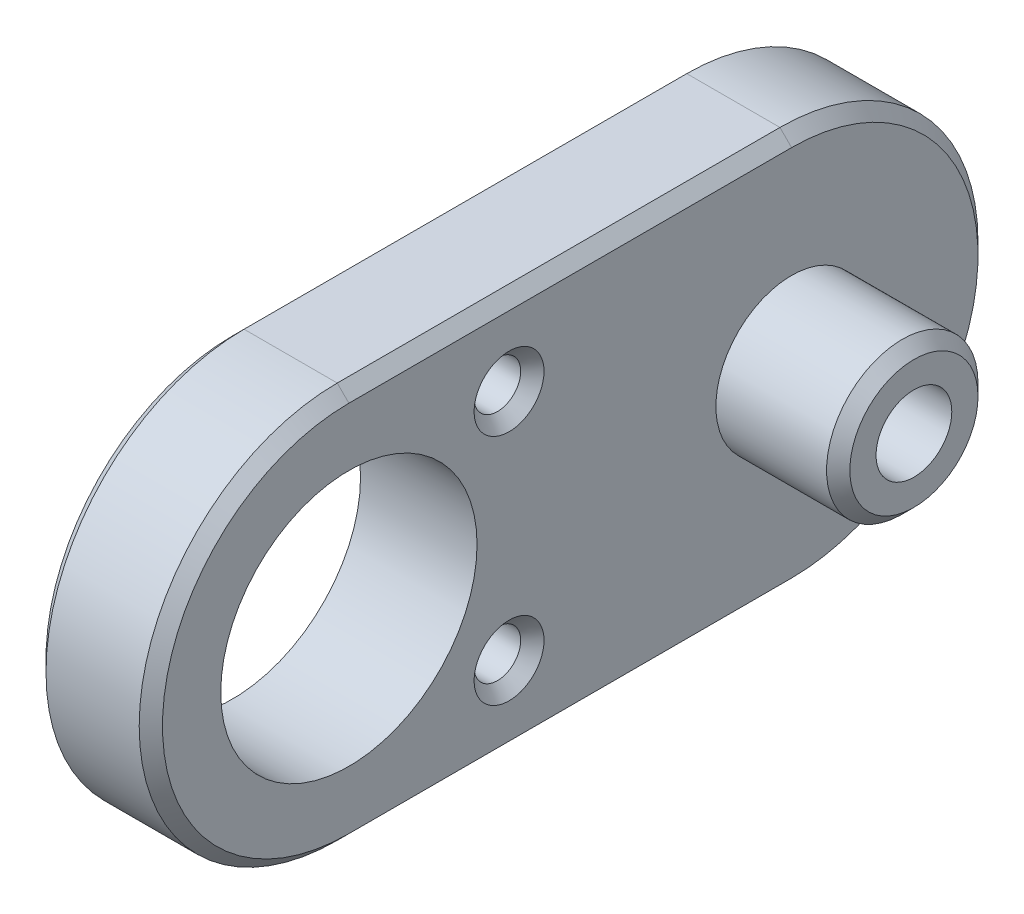
ISO-10303-21;
HEADER;
FILE_DESCRIPTION(('STEP AP214'),'2;1');
FILE_NAME('part.step','',(''),(''),'','','');
FILE_SCHEMA(('AUTOMOTIVE_DESIGN { 1 0 10303 214 1 1 1 1 }'));
ENDSEC;
DATA;
#1=APPLICATION_CONTEXT('core data for automotive mechanical design processes');
#2=APPLICATION_PROTOCOL_DEFINITION('international standard','automotive_design',2000,#1);
#3=PRODUCT_CONTEXT('',#1,'mechanical');
#4=PRODUCT('Part','Part','',(#3));
#5=PRODUCT_RELATED_PRODUCT_CATEGORY('part','',(#4));
#6=PRODUCT_DEFINITION_FORMATION('','',#4);
#7=PRODUCT_DEFINITION_CONTEXT('part definition',#1,'design');
#8=PRODUCT_DEFINITION('design','',#6,#7);
#9=PRODUCT_DEFINITION_SHAPE('','',#8);
#10=(LENGTH_UNIT() NAMED_UNIT(*) SI_UNIT(.MILLI.,.METRE.));
#11=(NAMED_UNIT(*) PLANE_ANGLE_UNIT() SI_UNIT($,.RADIAN.));
#12=(NAMED_UNIT(*) SI_UNIT($,.STERADIAN.) SOLID_ANGLE_UNIT());
#13=UNCERTAINTY_MEASURE_WITH_UNIT(LENGTH_MEASURE(1.E-05),#10,'distance_accuracy_value','');
#14=(GEOMETRIC_REPRESENTATION_CONTEXT(3) GLOBAL_UNCERTAINTY_ASSIGNED_CONTEXT((#13)) GLOBAL_UNIT_ASSIGNED_CONTEXT((#10,
#11,#12)) REPRESENTATION_CONTEXT('',''));
#15=CARTESIAN_POINT('',(0.,0.,0.));
#16=DIRECTION('',(0.,0.,1.));
#17=DIRECTION('',(1.,0.,0.));
#18=AXIS2_PLACEMENT_3D('',#15,#16,#17);
#19=CARTESIAN_POINT('',(5.,0.,0.));
#20=DIRECTION('',(-1.,0.,0.));
#21=DIRECTION('',(0.,0.,1.));
#22=AXIS2_PLACEMENT_3D('',#19,#20,#21);
#23=CYLINDRICAL_SURFACE('',#22,1.625);
#24=CARTESIAN_POINT('',(10.25,0.,0.));
#25=DIRECTION('',(1.,0.,0.));
#26=DIRECTION('',(0.,0.,-1.));
#27=AXIS2_PLACEMENT_3D('',#24,#25,#26);
#28=CIRCLE('',#27,1.625);
#29=CARTESIAN_POINT('',(10.25,0.,-1.625));
#30=VERTEX_POINT('',#29);
#31=EDGE_CURVE('E240',#30,#30,#28,.T.);
#32=ORIENTED_EDGE('',*,*,#31,.T.);
#33=EDGE_LOOP('',(#32));
#34=FACE_BOUND('',#33,.T.);
#35=CARTESIAN_POINT('',(3.,0.,0.));
#36=DIRECTION('',(-1.,0.,0.));
#37=DIRECTION('',(0.,0.,1.));
#38=AXIS2_PLACEMENT_3D('',#35,#36,#37);
#39=CIRCLE('',#38,1.625);
#40=CARTESIAN_POINT('',(3.,0.,1.625));
#41=VERTEX_POINT('',#40);
#42=EDGE_CURVE('E229',#41,#41,#39,.T.);
#43=ORIENTED_EDGE('',*,*,#42,.T.);
#44=EDGE_LOOP('',(#43));
#45=FACE_BOUND('',#44,.T.);
#46=ADVANCED_FACE('F72',(#34,#45),#23,.F.);
#47=CARTESIAN_POINT('',(5.,4.99999999999999,12.1261364575662));
#48=DIRECTION('',(-1.,0.,0.));
#49=DIRECTION('',(0.,0.,1.));
#50=AXIS2_PLACEMENT_3D('',#47,#48,#49);
#51=CYLINDRICAL_SURFACE('',#50,1.);
#52=CARTESIAN_POINT('',(4.50000000000001,4.99999999999999,12.1261364575662));
#53=DIRECTION('',(1.,0.,0.));
#54=DIRECTION('',(0.,0.,-1.));
#55=AXIS2_PLACEMENT_3D('',#52,#53,#54);
#56=CIRCLE('',#55,1.);
#57=CARTESIAN_POINT('',(4.50000000000001,4.99999999999999,11.1261364575662));
#58=VERTEX_POINT('',#57);
#59=EDGE_CURVE('E290',#58,#58,#56,.T.);
#60=ORIENTED_EDGE('',*,*,#59,.T.);
#61=EDGE_LOOP('',(#60));
#62=FACE_BOUND('',#61,.T.);
#63=CARTESIAN_POINT('',(0.500000000000008,4.99999999999999,12.1261364575662));
#64=DIRECTION('',(1.,0.,0.));
#65=DIRECTION('',(0.,0.,-1.));
#66=AXIS2_PLACEMENT_3D('',#63,#64,#65);
#67=CIRCLE('',#66,1.);
#68=CARTESIAN_POINT('',(0.500000000000008,4.99999999999999,11.1261364575662));
#69=VERTEX_POINT('',#68);
#70=EDGE_CURVE('E287',#69,#69,#67,.F.);
#71=ORIENTED_EDGE('',*,*,#70,.T.);
#72=EDGE_LOOP('',(#71));
#73=FACE_BOUND('',#72,.T.);
#74=ADVANCED_FACE('F450',(#62,#73),#51,.F.);
#75=CARTESIAN_POINT('',(5.,-5.,12.1261364575662));
#76=DIRECTION('',(-1.,0.,0.));
#77=DIRECTION('',(0.,0.,1.));
#78=AXIS2_PLACEMENT_3D('',#75,#76,#77);
#79=CYLINDRICAL_SURFACE('',#78,1.);
#80=CARTESIAN_POINT('',(4.5,-5.,12.1261364575662));
#81=DIRECTION('',(1.,0.,0.));
#82=DIRECTION('',(0.,0.,-1.));
#83=AXIS2_PLACEMENT_3D('',#80,#81,#82);
#84=CIRCLE('',#83,1.);
#85=CARTESIAN_POINT('',(4.5,-5.,11.1261364575662));
#86=VERTEX_POINT('',#85);
#87=EDGE_CURVE('E12',#86,#86,#84,.T.);
#88=ORIENTED_EDGE('',*,*,#87,.T.);
#89=EDGE_LOOP('',(#88));
#90=FACE_BOUND('',#89,.T.);
#91=CARTESIAN_POINT('',(0.500000000000007,-5.,12.1261364575662));
#92=DIRECTION('',(1.,0.,0.));
#93=DIRECTION('',(0.,0.,-1.));
#94=AXIS2_PLACEMENT_3D('',#91,#92,#93);
#95=CIRCLE('',#94,1.);
#96=CARTESIAN_POINT('',(0.500000000000007,-5.,11.1261364575662));
#97=VERTEX_POINT('',#96);
#98=EDGE_CURVE('E82',#97,#97,#95,.F.);
#99=ORIENTED_EDGE('',*,*,#98,.T.);
#100=EDGE_LOOP('',(#99));
#101=FACE_BOUND('',#100,.T.);
#102=ADVANCED_FACE('F445',(#90,#101),#79,.F.);
#103=CARTESIAN_POINT('',(5.,0.,19.));
#104=DIRECTION('',(-1.,0.,0.));
#105=DIRECTION('',(0.,0.,1.));
#106=AXIS2_PLACEMENT_3D('',#103,#104,#105);
#107=CYLINDRICAL_SURFACE('',#106,5.5);
#108=CARTESIAN_POINT('',(5.,0.,19.));
#109=DIRECTION('',(1.,0.,0.));
#110=DIRECTION('',(0.,0.,-1.));
#111=AXIS2_PLACEMENT_3D('',#108,#109,#110);
#112=CIRCLE('',#111,5.5);
#113=CARTESIAN_POINT('',(5.,0.,13.5));
#114=VERTEX_POINT('',#113);
#115=EDGE_CURVE('E244',#114,#114,#112,.T.);
#116=ORIENTED_EDGE('',*,*,#115,.T.);
#117=EDGE_LOOP('',(#116));
#118=FACE_BOUND('',#117,.T.);
#119=CARTESIAN_POINT('',(0.,0.,19.));
#120=DIRECTION('',(1.,0.,0.));
#121=DIRECTION('',(0.,0.,-1.));
#122=AXIS2_PLACEMENT_3D('',#119,#120,#121);
#123=CIRCLE('',#122,5.5);
#124=CARTESIAN_POINT('',(0.,0.,13.5));
#125=VERTEX_POINT('',#124);
#126=EDGE_CURVE('E248',#125,#125,#123,.T.);
#127=ORIENTED_EDGE('',*,*,#126,.F.);
#128=EDGE_LOOP('',(#127));
#129=FACE_BOUND('',#128,.T.);
#130=ADVANCED_FACE('F438',(#118,#129),#107,.F.);
#131=CARTESIAN_POINT('',(5.,0.,19.));
#132=DIRECTION('',(-1.,0.,0.));
#133=DIRECTION('',(0.,0.,1.));
#134=AXIS2_PLACEMENT_3D('',#131,#132,#133);
#135=CYLINDRICAL_SURFACE('',#134,8.5);
#136=DIRECTION('',(-1.,0.,0.));
#137=VECTOR('',#136,1.);
#138=CARTESIAN_POINT('',(5.,-8.5,19.));
#139=LINE('',#138,#137);
#140=CARTESIAN_POINT('',(4.5,-8.5,19.));
#141=VERTEX_POINT('',#140);
#142=CARTESIAN_POINT('',(0.500000000000002,-8.5,19.));
#143=VERTEX_POINT('',#142);
#144=EDGE_CURVE('E256',#141,#143,#139,.T.);
#145=ORIENTED_EDGE('',*,*,#144,.F.);
#146=CARTESIAN_POINT('',(4.5,0.,19.));
#147=DIRECTION('',(1.,0.,0.));
#148=DIRECTION('',(0.,0.,-1.));
#149=AXIS2_PLACEMENT_3D('',#146,#147,#148);
#150=CIRCLE('',#149,8.5);
#151=CARTESIAN_POINT('',(4.5,8.5,19.));
#152=VERTEX_POINT('',#151);
#153=EDGE_CURVE('E333',#141,#152,#150,.F.);
#154=ORIENTED_EDGE('',*,*,#153,.T.);
#155=DIRECTION('',(-1.,0.,0.));
#156=VECTOR('',#155,1.);
#157=CARTESIAN_POINT('',(5.,8.5,19.));
#158=LINE('',#157,#156);
#159=CARTESIAN_POINT('',(0.500000000000002,8.5,19.));
#160=VERTEX_POINT('',#159);
#161=EDGE_CURVE('E259',#152,#160,#158,.T.);
#162=ORIENTED_EDGE('',*,*,#161,.T.);
#163=CARTESIAN_POINT('',(0.500000000000002,0.,19.));
#164=DIRECTION('',(1.,0.,0.));
#165=DIRECTION('',(0.,0.,-1.));
#166=AXIS2_PLACEMENT_3D('',#163,#164,#165);
#167=CIRCLE('',#166,8.5);
#168=EDGE_CURVE('E331',#160,#143,#167,.T.);
#169=ORIENTED_EDGE('',*,*,#168,.T.);
#170=EDGE_LOOP('',(#145,#154,#162,#169));
#171=FACE_BOUND('',#170,.T.);
#172=ADVANCED_FACE('F436',(#171),#135,.T.);
#173=CARTESIAN_POINT('',(5.,-8.5,0.));
#174=DIRECTION('',(0.,-1.,0.));
#175=DIRECTION('',(0.,0.,-1.));
#176=AXIS2_PLACEMENT_3D('',#173,#174,#175);
#177=PLANE('',#176);
#178=DIRECTION('',(-1.,0.,0.));
#179=VECTOR('',#178,1.);
#180=CARTESIAN_POINT('',(5.,-8.5,0.));
#181=LINE('',#180,#179);
#182=CARTESIAN_POINT('',(4.5,-8.5,0.));
#183=VERTEX_POINT('',#182);
#184=CARTESIAN_POINT('',(0.500000000000002,-8.5,0.));
#185=VERTEX_POINT('',#184);
#186=EDGE_CURVE('E253',#183,#185,#181,.T.);
#187=ORIENTED_EDGE('',*,*,#186,.F.);
#188=DIRECTION('',(0.,0.,1.));
#189=VECTOR('',#188,1.);
#190=CARTESIAN_POINT('',(4.5,-8.5,0.));
#191=LINE('',#190,#189);
#192=EDGE_CURVE('E323',#183,#141,#191,.T.);
#193=ORIENTED_EDGE('',*,*,#192,.T.);
#194=ORIENTED_EDGE('',*,*,#144,.T.);
#195=DIRECTION('',(0.,0.,-1.));
#196=VECTOR('',#195,1.);
#197=CARTESIAN_POINT('',(0.500000000000002,-8.5,0.));
#198=LINE('',#197,#196);
#199=EDGE_CURVE('E321',#143,#185,#198,.T.);
#200=ORIENTED_EDGE('',*,*,#199,.T.);
#201=EDGE_LOOP('',(#187,#193,#194,#200));
#202=FACE_BOUND('',#201,.T.);
#203=ADVANCED_FACE('F433',(#202),#177,.T.);
#204=CARTESIAN_POINT('',(5.,0.,0.));
#205=DIRECTION('',(-1.,0.,0.));
#206=DIRECTION('',(0.,0.,1.));
#207=AXIS2_PLACEMENT_3D('',#204,#205,#206);
#208=CYLINDRICAL_SURFACE('',#207,8.5);
#209=DIRECTION('',(-1.,0.,0.));
#210=VECTOR('',#209,1.);
#211=CARTESIAN_POINT('',(5.,8.5,0.));
#212=LINE('',#211,#210);
#213=CARTESIAN_POINT('',(4.5,8.5,0.));
#214=VERTEX_POINT('',#213);
#215=CARTESIAN_POINT('',(0.500000000000002,8.5,0.));
#216=VERTEX_POINT('',#215);
#217=EDGE_CURVE('E247',#214,#216,#212,.T.);
#218=ORIENTED_EDGE('',*,*,#217,.F.);
#219=CARTESIAN_POINT('',(4.5,0.,0.));
#220=DIRECTION('',(1.,0.,0.));
#221=DIRECTION('',(0.,0.,-1.));
#222=AXIS2_PLACEMENT_3D('',#219,#220,#221);
#223=CIRCLE('',#222,8.5);
#224=EDGE_CURVE('E329',#214,#183,#223,.F.);
#225=ORIENTED_EDGE('',*,*,#224,.T.);
#226=ORIENTED_EDGE('',*,*,#186,.T.);
#227=CARTESIAN_POINT('',(0.500000000000002,0.,0.));
#228=DIRECTION('',(1.,0.,0.));
#229=DIRECTION('',(0.,0.,-1.));
#230=AXIS2_PLACEMENT_3D('',#227,#228,#229);
#231=CIRCLE('',#230,8.5);
#232=EDGE_CURVE('E326',#185,#216,#231,.T.);
#233=ORIENTED_EDGE('',*,*,#232,.T.);
#234=EDGE_LOOP('',(#218,#225,#226,#233));
#235=FACE_BOUND('',#234,.T.);
#236=ADVANCED_FACE('F406',(#235),#208,.T.);
#237=CARTESIAN_POINT('',(5.,8.5,0.));
#238=DIRECTION('',(0.,-1.,0.));
#239=DIRECTION('',(0.,0.,-1.));
#240=AXIS2_PLACEMENT_3D('',#237,#238,#239);
#241=PLANE('',#240);
#242=ORIENTED_EDGE('',*,*,#161,.F.);
#243=DIRECTION('',(0.,0.,-1.));
#244=VECTOR('',#243,1.);
#245=CARTESIAN_POINT('',(4.5,8.5,0.));
#246=LINE('',#245,#244);
#247=EDGE_CURVE('E337',#152,#214,#246,.T.);
#248=ORIENTED_EDGE('',*,*,#247,.T.);
#249=ORIENTED_EDGE('',*,*,#217,.T.);
#250=DIRECTION('',(0.,0.,1.));
#251=VECTOR('',#250,1.);
#252=CARTESIAN_POINT('',(0.500000000000002,8.5,0.));
#253=LINE('',#252,#251);
#254=EDGE_CURVE('E335',#216,#160,#253,.T.);
#255=ORIENTED_EDGE('',*,*,#254,.T.);
#256=EDGE_LOOP('',(#242,#248,#249,#255));
#257=FACE_BOUND('',#256,.T.);
#258=ADVANCED_FACE('F409',(#257),#241,.F.);
#259=CARTESIAN_POINT('',(0.,0.,0.));
#260=DIRECTION('',(1.,0.,0.));
#261=DIRECTION('',(0.,0.,-1.));
#262=AXIS2_PLACEMENT_3D('',#259,#260,#261);
#263=PLANE('',#262);
#264=CARTESIAN_POINT('',(0.,4.99999999999999,12.1261364575662));
#265=DIRECTION('',(1.,0.,0.));
#266=DIRECTION('',(0.,0.,-1.));
#267=AXIS2_PLACEMENT_3D('',#264,#265,#266);
#268=CIRCLE('',#267,1.50000000000002);
#269=CARTESIAN_POINT('',(0.,4.99999999999999,10.6261364575662));
#270=VERTEX_POINT('',#269);
#271=EDGE_CURVE('E318',#270,#270,#268,.T.);
#272=ORIENTED_EDGE('',*,*,#271,.T.);
#273=EDGE_LOOP('',(#272));
#274=FACE_BOUND('',#273,.T.);
#275=DIRECTION('',(0.,0.5,0.866025403784439));
#276=VECTOR('',#275,1.);
#277=CARTESIAN_POINT('',(0.,2.92283573777248,-1.6875));
#278=LINE('',#277,#276);
#279=CARTESIAN_POINT('',(0.,1.94855715851499,-3.375));
#280=VERTEX_POINT('',#279);
#281=CARTESIAN_POINT('',(0.,3.89711431702998,0.));
#282=VERTEX_POINT('',#281);
#283=EDGE_CURVE('E313',#280,#282,#278,.T.);
#284=ORIENTED_EDGE('',*,*,#283,.T.);
#285=DIRECTION('',(0.,-0.5,0.866025403784439));
#286=VECTOR('',#285,1.);
#287=CARTESIAN_POINT('',(0.,2.92283573777248,1.6875));
#288=LINE('',#287,#286);
#289=CARTESIAN_POINT('',(0.,1.94855715851499,3.375));
#290=VERTEX_POINT('',#289);
#291=EDGE_CURVE('E315',#282,#290,#288,.T.);
#292=ORIENTED_EDGE('',*,*,#291,.T.);
#293=DIRECTION('',(0.,-1.,0.));
#294=VECTOR('',#293,1.);
#295=CARTESIAN_POINT('',(0.,0.,3.375));
#296=LINE('',#295,#294);
#297=CARTESIAN_POINT('',(0.,-1.94855715851499,3.375));
#298=VERTEX_POINT('',#297);
#299=EDGE_CURVE('E305',#290,#298,#296,.T.);
#300=ORIENTED_EDGE('',*,*,#299,.T.);
#301=DIRECTION('',(0.,-0.5,-0.866025403784439));
#302=VECTOR('',#301,1.);
#303=CARTESIAN_POINT('',(0.,-2.92283573777248,1.6875));
#304=LINE('',#303,#302);
#305=CARTESIAN_POINT('',(0.,-3.89711431702998,0.));
#306=VERTEX_POINT('',#305);
#307=EDGE_CURVE('E307',#298,#306,#304,.T.);
#308=ORIENTED_EDGE('',*,*,#307,.T.);
#309=DIRECTION('',(0.,0.5,-0.866025403784439));
#310=VECTOR('',#309,1.);
#311=CARTESIAN_POINT('',(0.,-2.92283573777248,-1.6875));
#312=LINE('',#311,#310);
#313=CARTESIAN_POINT('',(0.,-1.94855715851499,-3.375));
#314=VERTEX_POINT('',#313);
#315=EDGE_CURVE('E309',#306,#314,#312,.T.);
#316=ORIENTED_EDGE('',*,*,#315,.T.);
#317=DIRECTION('',(0.,1.,0.));
#318=VECTOR('',#317,1.);
#319=CARTESIAN_POINT('',(0.,0.,-3.375));
#320=LINE('',#319,#318);
#321=EDGE_CURVE('E311',#314,#280,#320,.T.);
#322=ORIENTED_EDGE('',*,*,#321,.T.);
#323=EDGE_LOOP('',(#284,#292,#300,#308,#316,#322));
#324=FACE_BOUND('',#323,.T.);
#325=CARTESIAN_POINT('',(0.,-5.,12.1261364575662));
#326=DIRECTION('',(1.,0.,0.));
#327=DIRECTION('',(0.,0.,-1.));
#328=AXIS2_PLACEMENT_3D('',#325,#326,#327);
#329=CIRCLE('',#328,1.50000000000001);
#330=CARTESIAN_POINT('',(0.,-5.,10.6261364575662));
#331=VERTEX_POINT('',#330);
#332=EDGE_CURVE('E302',#331,#331,#329,.T.);
#333=ORIENTED_EDGE('',*,*,#332,.T.);
#334=EDGE_LOOP('',(#333));
#335=FACE_BOUND('',#334,.T.);
#336=DIRECTION('',(0.,0.,-1.));
#337=VECTOR('',#336,1.);
#338=CARTESIAN_POINT('',(0.,8.,0.));
#339=LINE('',#338,#337);
#340=CARTESIAN_POINT('',(0.,8.,19.));
#341=VERTEX_POINT('',#340);
#342=CARTESIAN_POINT('',(0.,8.,0.));
#343=VERTEX_POINT('',#342);
#344=EDGE_CURVE('E297',#341,#343,#339,.T.);
#345=ORIENTED_EDGE('',*,*,#344,.T.);
#346=CARTESIAN_POINT('',(0.,0.,0.));
#347=DIRECTION('',(1.,0.,0.));
#348=DIRECTION('',(0.,0.,-1.));
#349=AXIS2_PLACEMENT_3D('',#346,#347,#348);
#350=CIRCLE('',#349,8.);
#351=CARTESIAN_POINT('',(0.,-8.,0.));
#352=VERTEX_POINT('',#351);
#353=EDGE_CURVE('E299',#343,#352,#350,.F.);
#354=ORIENTED_EDGE('',*,*,#353,.T.);
#355=DIRECTION('',(0.,0.,1.));
#356=VECTOR('',#355,1.);
#357=CARTESIAN_POINT('',(0.,-8.,19.));
#358=LINE('',#357,#356);
#359=CARTESIAN_POINT('',(0.,-8.,19.));
#360=VERTEX_POINT('',#359);
#361=EDGE_CURVE('E295',#352,#360,#358,.T.);
#362=ORIENTED_EDGE('',*,*,#361,.T.);
#363=CARTESIAN_POINT('',(0.,0.,19.));
#364=DIRECTION('',(1.,0.,0.));
#365=DIRECTION('',(0.,0.,-1.));
#366=AXIS2_PLACEMENT_3D('',#363,#364,#365);
#367=CIRCLE('',#366,8.);
#368=EDGE_CURVE('E293',#360,#341,#367,.F.);
#369=ORIENTED_EDGE('',*,*,#368,.T.);
#370=EDGE_LOOP('',(#345,#354,#362,#369));
#371=FACE_BOUND('',#370,.T.);
#372=ORIENTED_EDGE('',*,*,#126,.T.);
#373=EDGE_LOOP('',(#372));
#374=FACE_BOUND('',#373,.T.);
#375=ADVANCED_FACE('F394',(#274,#324,#335,#371,#374),#263,.F.);
#376=CARTESIAN_POINT('',(5.,0.,0.));
#377=DIRECTION('',(1.,0.,0.));
#378=DIRECTION('',(0.,0.,-1.));
#379=AXIS2_PLACEMENT_3D('',#376,#377,#378);
#380=PLANE('',#379);
#381=CARTESIAN_POINT('',(5.,4.99999999999999,12.1261364575662));
#382=DIRECTION('',(1.,0.,0.));
#383=DIRECTION('',(0.,0.,-1.));
#384=AXIS2_PLACEMENT_3D('',#381,#382,#383);
#385=CIRCLE('',#384,1.5);
#386=CARTESIAN_POINT('',(5.,4.99999999999999,10.6261364575662));
#387=VERTEX_POINT('',#386);
#388=EDGE_CURVE('E284',#387,#387,#385,.F.);
#389=ORIENTED_EDGE('',*,*,#388,.T.);
#390=EDGE_LOOP('',(#389));
#391=FACE_BOUND('',#390,.T.);
#392=CARTESIAN_POINT('',(5.,0.,19.));
#393=DIRECTION('',(1.,0.,0.));
#394=DIRECTION('',(0.,0.,-1.));
#395=AXIS2_PLACEMENT_3D('',#392,#393,#394);
#396=CIRCLE('',#395,8.);
#397=CARTESIAN_POINT('',(5.,8.,19.));
#398=VERTEX_POINT('',#397);
#399=CARTESIAN_POINT('',(5.,-8.,19.));
#400=VERTEX_POINT('',#399);
#401=EDGE_CURVE('E277',#398,#400,#396,.T.);
#402=ORIENTED_EDGE('',*,*,#401,.T.);
#403=DIRECTION('',(0.,0.,-1.));
#404=VECTOR('',#403,1.);
#405=CARTESIAN_POINT('',(5.,-8.00000000000001,0.));
#406=LINE('',#405,#404);
#407=CARTESIAN_POINT('',(5.,-8.00000000000001,0.));
#408=VERTEX_POINT('',#407);
#409=EDGE_CURVE('E281',#400,#408,#406,.T.);
#410=ORIENTED_EDGE('',*,*,#409,.T.);
#411=CARTESIAN_POINT('',(5.,0.,0.));
#412=DIRECTION('',(1.,0.,0.));
#413=DIRECTION('',(0.,0.,-1.));
#414=AXIS2_PLACEMENT_3D('',#411,#412,#413);
#415=CIRCLE('',#414,8.00000000000001);
#416=CARTESIAN_POINT('',(5.,8.00000000000001,0.));
#417=VERTEX_POINT('',#416);
#418=EDGE_CURVE('E279',#408,#417,#415,.T.);
#419=ORIENTED_EDGE('',*,*,#418,.T.);
#420=DIRECTION('',(0.,0.,1.));
#421=VECTOR('',#420,1.);
#422=CARTESIAN_POINT('',(5.,8.,19.));
#423=LINE('',#422,#421);
#424=EDGE_CURVE('E275',#417,#398,#423,.T.);
#425=ORIENTED_EDGE('',*,*,#424,.T.);
#426=EDGE_LOOP('',(#402,#410,#419,#425));
#427=FACE_BOUND('',#426,.T.);
#428=CARTESIAN_POINT('',(5.,-5.,12.1261364575662));
#429=DIRECTION('',(1.,0.,0.));
#430=DIRECTION('',(0.,0.,-1.));
#431=AXIS2_PLACEMENT_3D('',#428,#429,#430);
#432=CIRCLE('',#431,1.5);
#433=CARTESIAN_POINT('',(5.,-5.,10.6261364575662));
#434=VERTEX_POINT('',#433);
#435=EDGE_CURVE('E272',#434,#434,#432,.F.);
#436=ORIENTED_EDGE('',*,*,#435,.T.);
#437=EDGE_LOOP('',(#436));
#438=FACE_BOUND('',#437,.T.);
#439=CARTESIAN_POINT('',(5.,0.,0.));
#440=DIRECTION('',(1.,0.,0.));
#441=DIRECTION('',(0.,0.,-1.));
#442=AXIS2_PLACEMENT_3D('',#439,#440,#441);
#443=CIRCLE('',#442,3.25);
#444=CARTESIAN_POINT('',(5.,0.,-3.25000000000001));
#445=VERTEX_POINT('',#444);
#446=EDGE_CURVE('E243',#445,#445,#443,.F.);
#447=ORIENTED_EDGE('',*,*,#446,.T.);
#448=EDGE_LOOP('',(#447));
#449=FACE_BOUND('',#448,.T.);
#450=ORIENTED_EDGE('',*,*,#115,.F.);
#451=EDGE_LOOP('',(#450));
#452=FACE_BOUND('',#451,.T.);
#453=ADVANCED_FACE('F423',(#391,#427,#438,#449,#452),#380,.T.);
#454=CARTESIAN_POINT('',(19.6923881554251,0.,0.));
#455=DIRECTION('',(-1.,0.,0.));
#456=DIRECTION('',(0.,0.,1.));
#457=AXIS2_PLACEMENT_3D('',#454,#455,#456);
#458=CYLINDRICAL_SURFACE('',#457,3.25);
#459=CARTESIAN_POINT('',(9.75,0.,0.));
#460=DIRECTION('',(1.,0.,0.));
#461=DIRECTION('',(0.,0.,-1.));
#462=AXIS2_PLACEMENT_3D('',#459,#460,#461);
#463=CIRCLE('',#462,3.25);
#464=CARTESIAN_POINT('',(9.75,0.,-3.25000000000001));
#465=VERTEX_POINT('',#464);
#466=EDGE_CURVE('E269',#465,#465,#463,.F.);
#467=ORIENTED_EDGE('',*,*,#466,.T.);
#468=EDGE_LOOP('',(#467));
#469=FACE_BOUND('',#468,.T.);
#470=ORIENTED_EDGE('',*,*,#446,.F.);
#471=EDGE_LOOP('',(#470));
#472=FACE_BOUND('',#471,.T.);
#473=ADVANCED_FACE('F694',(#469,#472),#458,.T.);
#474=CARTESIAN_POINT('',(10.25,0.,0.));
#475=DIRECTION('',(1.,0.,0.));
#476=DIRECTION('',(0.,-0.596885659902138,-0.80232631080078));
#477=AXIS2_PLACEMENT_3D('',#474,#475,#476);
#478=PLANE('',#477);
#479=CARTESIAN_POINT('',(10.25,0.,0.));
#480=DIRECTION('',(1.,0.,0.));
#481=DIRECTION('',(0.,0.,-1.));
#482=AXIS2_PLACEMENT_3D('',#479,#480,#481);
#483=CIRCLE('',#482,2.75);
#484=CARTESIAN_POINT('',(10.25,0.,-2.75000000000001));
#485=VERTEX_POINT('',#484);
#486=EDGE_CURVE('E262',#485,#485,#483,.T.);
#487=ORIENTED_EDGE('',*,*,#486,.T.);
#488=EDGE_LOOP('',(#487));
#489=FACE_BOUND('',#488,.T.);
#490=ORIENTED_EDGE('',*,*,#31,.F.);
#491=EDGE_LOOP('',(#490));
#492=FACE_BOUND('',#491,.T.);
#493=ADVANCED_FACE('F687',(#489,#492),#478,.T.);
#494=CARTESIAN_POINT('',(3.,-1.65988202392017,-2.875));
#495=DIRECTION('',(0.,-0.866025403784439,-0.5));
#496=DIRECTION('',(0.,0.5,-0.866025403784439));
#497=AXIS2_PLACEMENT_3D('',#494,#495,#496);
#498=PLANE('',#497);
#499=DIRECTION('',(-1.,0.,0.));
#500=VECTOR('',#499,1.);
#501=CARTESIAN_POINT('',(3.,-1.65988202392017,-2.875));
#502=LINE('',#501,#500);
#503=CARTESIAN_POINT('',(3.,-1.65988202392017,-2.875));
#504=VERTEX_POINT('',#503);
#505=CARTESIAN_POINT('',(0.500000000000004,-1.65988202392017,-2.875));
#506=VERTEX_POINT('',#505);
#507=EDGE_CURVE('E227',#504,#506,#502,.T.);
#508=ORIENTED_EDGE('',*,*,#507,.T.);
#509=DIRECTION('',(0.,-0.5,0.866025403784439));
#510=VECTOR('',#509,1.);
#511=CARTESIAN_POINT('',(0.500000000000004,-1.65988202392017,-2.875));
#512=LINE('',#511,#510);
#513=CARTESIAN_POINT('',(0.500000000000004,-3.31976404784035,0.));
#514=VERTEX_POINT('',#513);
#515=EDGE_CURVE('E98',#506,#514,#512,.T.);
#516=ORIENTED_EDGE('',*,*,#515,.T.);
#517=DIRECTION('',(-1.,0.,0.));
#518=VECTOR('',#517,1.);
#519=CARTESIAN_POINT('',(3.,-3.31976404784035,0.));
#520=LINE('',#519,#518);
#521=CARTESIAN_POINT('',(3.,-3.31976404784035,0.));
#522=VERTEX_POINT('',#521);
#523=EDGE_CURVE('E193',#522,#514,#520,.T.);
#524=ORIENTED_EDGE('',*,*,#523,.F.);
#525=DIRECTION('',(0.,-0.5,0.866025403784439));
#526=VECTOR('',#525,1.);
#527=CARTESIAN_POINT('',(3.,-1.65988202392017,-2.875));
#528=LINE('',#527,#526);
#529=EDGE_CURVE('E197',#504,#522,#528,.T.);
#530=ORIENTED_EDGE('',*,*,#529,.F.);
#531=EDGE_LOOP('',(#508,#516,#524,#530));
#532=FACE_BOUND('',#531,.T.);
#533=ADVANCED_FACE('F195',(#532),#498,.F.);
#534=CARTESIAN_POINT('',(3.,1.65988202392017,-2.875));
#535=DIRECTION('',(0.,0.,-1.));
#536=DIRECTION('',(0.,1.,0.));
#537=AXIS2_PLACEMENT_3D('',#534,#535,#536);
#538=PLANE('',#537);
#539=DIRECTION('',(-1.,0.,0.));
#540=VECTOR('',#539,1.);
#541=CARTESIAN_POINT('',(3.,1.65988202392017,-2.875));
#542=LINE('',#541,#540);
#543=CARTESIAN_POINT('',(3.,1.65988202392017,-2.875));
#544=VERTEX_POINT('',#543);
#545=CARTESIAN_POINT('',(0.500000000000004,1.65988202392017,-2.875));
#546=VERTEX_POINT('',#545);
#547=EDGE_CURVE('E230',#544,#546,#542,.T.);
#548=ORIENTED_EDGE('',*,*,#547,.T.);
#549=DIRECTION('',(0.,-1.,0.));
#550=VECTOR('',#549,1.);
#551=CARTESIAN_POINT('',(0.500000000000004,1.65988202392017,-2.875));
#552=LINE('',#551,#550);
#553=EDGE_CURVE('E344',#546,#506,#552,.T.);
#554=ORIENTED_EDGE('',*,*,#553,.T.);
#555=ORIENTED_EDGE('',*,*,#507,.F.);
#556=DIRECTION('',(0.,-1.,0.));
#557=VECTOR('',#556,1.);
#558=CARTESIAN_POINT('',(3.,1.65988202392017,-2.875));
#559=LINE('',#558,#557);
#560=EDGE_CURVE('E201',#544,#504,#559,.T.);
#561=ORIENTED_EDGE('',*,*,#560,.F.);
#562=EDGE_LOOP('',(#548,#554,#555,#561));
#563=FACE_BOUND('',#562,.T.);
#564=ADVANCED_FACE('F672',(#563),#538,.F.);
#565=CARTESIAN_POINT('',(3.,3.31976404784035,0.));
#566=DIRECTION('',(0.,0.866025403784439,-0.5));
#567=DIRECTION('',(0.,0.5,0.866025403784439));
#568=AXIS2_PLACEMENT_3D('',#565,#566,#567);
#569=PLANE('',#568);
#570=DIRECTION('',(-1.,0.,0.));
#571=VECTOR('',#570,1.);
#572=CARTESIAN_POINT('',(3.,3.31976404784035,0.));
#573=LINE('',#572,#571);
#574=CARTESIAN_POINT('',(3.,3.31976404784035,0.));
#575=VERTEX_POINT('',#574);
#576=CARTESIAN_POINT('',(0.500000000000004,3.31976404784035,0.));
#577=VERTEX_POINT('',#576);
#578=EDGE_CURVE('E233',#575,#577,#573,.T.);
#579=ORIENTED_EDGE('',*,*,#578,.T.);
#580=DIRECTION('',(0.,-0.5,-0.866025403784439));
#581=VECTOR('',#580,1.);
#582=CARTESIAN_POINT('',(0.500000000000004,3.31976404784035,0.));
#583=LINE('',#582,#581);
#584=EDGE_CURVE('E342',#577,#546,#583,.T.);
#585=ORIENTED_EDGE('',*,*,#584,.T.);
#586=ORIENTED_EDGE('',*,*,#547,.F.);
#587=DIRECTION('',(0.,-0.5,-0.866025403784439));
#588=VECTOR('',#587,1.);
#589=CARTESIAN_POINT('',(3.,3.31976404784035,0.));
#590=LINE('',#589,#588);
#591=EDGE_CURVE('E224',#575,#544,#590,.T.);
#592=ORIENTED_EDGE('',*,*,#591,.F.);
#593=EDGE_LOOP('',(#579,#585,#586,#592));
#594=FACE_BOUND('',#593,.T.);
#595=ADVANCED_FACE('F664',(#594),#569,.F.);
#596=CARTESIAN_POINT('',(3.,1.65988202392018,2.875));
#597=DIRECTION('',(0.,0.866025403784439,0.5));
#598=DIRECTION('',(0.,-0.5,0.866025403784439));
#599=AXIS2_PLACEMENT_3D('',#596,#597,#598);
#600=PLANE('',#599);
#601=DIRECTION('',(-1.,0.,0.));
#602=VECTOR('',#601,1.);
#603=CARTESIAN_POINT('',(3.,1.65988202392018,2.875));
#604=LINE('',#603,#602);
#605=CARTESIAN_POINT('',(3.,1.65988202392018,2.875));
#606=VERTEX_POINT('',#605);
#607=CARTESIAN_POINT('',(0.500000000000004,1.65988202392018,2.875));
#608=VERTEX_POINT('',#607);
#609=EDGE_CURVE('E236',#606,#608,#604,.T.);
#610=ORIENTED_EDGE('',*,*,#609,.T.);
#611=DIRECTION('',(0.,0.5,-0.866025403784439));
#612=VECTOR('',#611,1.);
#613=CARTESIAN_POINT('',(0.500000000000004,1.65988202392018,2.875));
#614=LINE('',#613,#612);
#615=EDGE_CURVE('E339',#608,#577,#614,.T.);
#616=ORIENTED_EDGE('',*,*,#615,.T.);
#617=ORIENTED_EDGE('',*,*,#578,.F.);
#618=DIRECTION('',(0.,0.5,-0.866025403784439));
#619=VECTOR('',#618,1.);
#620=CARTESIAN_POINT('',(3.,1.65988202392018,2.875));
#621=LINE('',#620,#619);
#622=EDGE_CURVE('E221',#606,#575,#621,.T.);
#623=ORIENTED_EDGE('',*,*,#622,.F.);
#624=EDGE_LOOP('',(#610,#616,#617,#623));
#625=FACE_BOUND('',#624,.T.);
#626=ADVANCED_FACE('F656',(#625),#600,.F.);
#627=CARTESIAN_POINT('',(3.,-1.65988202392017,2.875));
#628=DIRECTION('',(0.,0.,1.));
#629=DIRECTION('',(0.,-1.,0.));
#630=AXIS2_PLACEMENT_3D('',#627,#628,#629);
#631=PLANE('',#630);
#632=DIRECTION('',(-1.,0.,0.));
#633=VECTOR('',#632,1.);
#634=CARTESIAN_POINT('',(3.,-1.65988202392017,2.875));
#635=LINE('',#634,#633);
#636=CARTESIAN_POINT('',(3.,-1.65988202392017,2.875));
#637=VERTEX_POINT('',#636);
#638=CARTESIAN_POINT('',(0.500000000000004,-1.65988202392017,2.875));
#639=VERTEX_POINT('',#638);
#640=EDGE_CURVE('E200',#637,#639,#635,.T.);
#641=ORIENTED_EDGE('',*,*,#640,.T.);
#642=DIRECTION('',(0.,1.,0.));
#643=VECTOR('',#642,1.);
#644=CARTESIAN_POINT('',(0.500000000000004,-1.65988202392017,2.875));
#645=LINE('',#644,#643);
#646=EDGE_CURVE('E348',#639,#608,#645,.T.);
#647=ORIENTED_EDGE('',*,*,#646,.T.);
#648=ORIENTED_EDGE('',*,*,#609,.F.);
#649=DIRECTION('',(0.,1.,0.));
#650=VECTOR('',#649,1.);
#651=CARTESIAN_POINT('',(3.,-1.65988202392017,2.875));
#652=LINE('',#651,#650);
#653=EDGE_CURVE('E209',#637,#606,#652,.T.);
#654=ORIENTED_EDGE('',*,*,#653,.F.);
#655=EDGE_LOOP('',(#641,#647,#648,#654));
#656=FACE_BOUND('',#655,.T.);
#657=ADVANCED_FACE('F649',(#656),#631,.F.);
#658=CARTESIAN_POINT('',(3.,-3.31976404784035,0.));
#659=DIRECTION('',(0.,-0.866025403784439,0.5));
#660=DIRECTION('',(0.,-0.5,-0.866025403784439));
#661=AXIS2_PLACEMENT_3D('',#658,#659,#660);
#662=PLANE('',#661);
#663=ORIENTED_EDGE('',*,*,#523,.T.);
#664=DIRECTION('',(0.,0.5,0.866025403784439));
#665=VECTOR('',#664,1.);
#666=CARTESIAN_POINT('',(0.500000000000004,-3.31976404784035,0.));
#667=LINE('',#666,#665);
#668=EDGE_CURVE('E90',#514,#639,#667,.T.);
#669=ORIENTED_EDGE('',*,*,#668,.T.);
#670=ORIENTED_EDGE('',*,*,#640,.F.);
#671=DIRECTION('',(0.,0.5,0.866025403784439));
#672=VECTOR('',#671,1.);
#673=CARTESIAN_POINT('',(3.,-3.31976404784035,0.));
#674=LINE('',#673,#672);
#675=EDGE_CURVE('E204',#522,#637,#674,.T.);
#676=ORIENTED_EDGE('',*,*,#675,.F.);
#677=EDGE_LOOP('',(#663,#669,#670,#676));
#678=FACE_BOUND('',#677,.T.);
#679=ADVANCED_FACE('F205',(#678),#662,.F.);
#680=CARTESIAN_POINT('',(3.,0.,0.));
#681=DIRECTION('',(-1.,0.,0.));
#682=DIRECTION('',(0.,0.,1.));
#683=AXIS2_PLACEMENT_3D('',#680,#681,#682);
#684=PLANE('',#683);
#685=ORIENTED_EDGE('',*,*,#42,.F.);
#686=EDGE_LOOP('',(#685));
#687=FACE_BOUND('',#686,.T.);
#688=ORIENTED_EDGE('',*,*,#529,.T.);
#689=ORIENTED_EDGE('',*,*,#675,.T.);
#690=ORIENTED_EDGE('',*,*,#653,.T.);
#691=ORIENTED_EDGE('',*,*,#622,.T.);
#692=ORIENTED_EDGE('',*,*,#591,.T.);
#693=ORIENTED_EDGE('',*,*,#560,.T.);
#694=EDGE_LOOP('',(#688,#689,#690,#691,#692,#693));
#695=FACE_BOUND('',#694,.T.);
#696=ADVANCED_FACE('F211',(#687,#695),#684,.T.);
#697=CARTESIAN_POINT('',(10.25,0.,0.));
#698=DIRECTION('',(-1.,0.,0.));
#699=DIRECTION('',(0.,0.,1.));
#700=AXIS2_PLACEMENT_3D('',#697,#698,#699);
#701=CONICAL_SURFACE('',#700,2.75,0.785398163397447);
#702=ORIENTED_EDGE('',*,*,#466,.F.);
#703=EDGE_LOOP('',(#702));
#704=FACE_BOUND('',#703,.T.);
#705=ORIENTED_EDGE('',*,*,#486,.F.);
#706=EDGE_LOOP('',(#705));
#707=FACE_BOUND('',#706,.T.);
#708=ADVANCED_FACE('F461',(#704,#707),#701,.T.);
#709=CARTESIAN_POINT('',(5.,4.99999999999999,12.1261364575662));
#710=DIRECTION('',(1.,0.,0.));
#711=DIRECTION('',(0.,0.,-1.));
#712=AXIS2_PLACEMENT_3D('',#709,#710,#711);
#713=CONICAL_SURFACE('',#712,1.5,0.785398163397449);
#714=ORIENTED_EDGE('',*,*,#59,.F.);
#715=EDGE_LOOP('',(#714));
#716=FACE_BOUND('',#715,.T.);
#717=ORIENTED_EDGE('',*,*,#388,.F.);
#718=EDGE_LOOP('',(#717));
#719=FACE_BOUND('',#718,.T.);
#720=ADVANCED_FACE('F467',(#716,#719),#713,.F.);
#721=CARTESIAN_POINT('',(0.500000000000008,4.99999999999999,12.1261364575662));
#722=DIRECTION('',(-1.,0.,0.));
#723=DIRECTION('',(0.,0.,1.));
#724=AXIS2_PLACEMENT_3D('',#721,#722,#723);
#725=CONICAL_SURFACE('',#724,1.,0.785398163397452);
#726=ORIENTED_EDGE('',*,*,#271,.F.);
#727=EDGE_LOOP('',(#726));
#728=FACE_BOUND('',#727,.T.);
#729=ORIENTED_EDGE('',*,*,#70,.F.);
#730=EDGE_LOOP('',(#729));
#731=FACE_BOUND('',#730,.T.);
#732=ADVANCED_FACE('F474',(#728,#731),#725,.F.);
#733=CARTESIAN_POINT('',(5.,8.00000000000001,0.));
#734=DIRECTION('',(0.707106781186547,0.707106781186547,0.));
#735=DIRECTION('',(0.,0.,-1.));
#736=AXIS2_PLACEMENT_3D('',#733,#734,#735);
#737=PLANE('',#736);
#738=DIRECTION('',(-0.707106781186547,0.707106781186547,0.));
#739=VECTOR('',#738,1.);
#740=CARTESIAN_POINT('',(5.,8.,19.));
#741=LINE('',#740,#739);
#742=EDGE_CURVE('E217',#398,#152,#741,.T.);
#743=ORIENTED_EDGE('',*,*,#742,.F.);
#744=ORIENTED_EDGE('',*,*,#424,.F.);
#745=DIRECTION('',(0.707106781186547,-0.707106781186547,0.));
#746=VECTOR('',#745,1.);
#747=CARTESIAN_POINT('',(4.5,8.5,0.));
#748=LINE('',#747,#746);
#749=EDGE_CURVE('E214',#214,#417,#748,.T.);
#750=ORIENTED_EDGE('',*,*,#749,.F.);
#751=ORIENTED_EDGE('',*,*,#247,.F.);
#752=EDGE_LOOP('',(#743,#744,#750,#751));
#753=FACE_BOUND('',#752,.T.);
#754=ADVANCED_FACE('F413',(#753),#737,.T.);
#755=CARTESIAN_POINT('',(5.,0.,0.));
#756=DIRECTION('',(-1.,0.,0.));
#757=DIRECTION('',(0.,0.,1.));
#758=AXIS2_PLACEMENT_3D('',#755,#756,#757);
#759=CONICAL_SURFACE('',#758,8.00000000000001,0.785398163397448);
#760=ORIENTED_EDGE('',*,*,#749,.T.);
#761=ORIENTED_EDGE('',*,*,#418,.F.);
#762=DIRECTION('',(0.707106781186547,0.707106781186547,0.));
#763=VECTOR('',#762,1.);
#764=CARTESIAN_POINT('',(4.5,-8.5,0.));
#765=LINE('',#764,#763);
#766=EDGE_CURVE('E354',#183,#408,#765,.T.);
#767=ORIENTED_EDGE('',*,*,#766,.F.);
#768=ORIENTED_EDGE('',*,*,#224,.F.);
#769=EDGE_LOOP('',(#760,#761,#767,#768));
#770=FACE_BOUND('',#769,.T.);
#771=ADVANCED_FACE('F431',(#770),#759,.T.);
#772=CARTESIAN_POINT('',(5.,0.,19.));
#773=DIRECTION('',(-1.,0.,0.));
#774=DIRECTION('',(0.,0.,1.));
#775=AXIS2_PLACEMENT_3D('',#772,#773,#774);
#776=CONICAL_SURFACE('',#775,8.,0.785398163397448);
#777=ORIENTED_EDGE('',*,*,#742,.T.);
#778=ORIENTED_EDGE('',*,*,#153,.F.);
#779=DIRECTION('',(-0.707106781186547,-0.707106781186547,0.));
#780=VECTOR('',#779,1.);
#781=CARTESIAN_POINT('',(5.,-8.,19.));
#782=LINE('',#781,#780);
#783=EDGE_CURVE('E352',#400,#141,#782,.T.);
#784=ORIENTED_EDGE('',*,*,#783,.F.);
#785=ORIENTED_EDGE('',*,*,#401,.F.);
#786=EDGE_LOOP('',(#777,#778,#784,#785));
#787=FACE_BOUND('',#786,.T.);
#788=ADVANCED_FACE('F419',(#787),#776,.T.);
#789=CARTESIAN_POINT('',(4.5,-8.5,0.));
#790=DIRECTION('',(-0.707106781186547,0.707106781186547,0.));
#791=DIRECTION('',(0.,0.,1.));
#792=AXIS2_PLACEMENT_3D('',#789,#790,#791);
#793=PLANE('',#792);
#794=ORIENTED_EDGE('',*,*,#766,.T.);
#795=ORIENTED_EDGE('',*,*,#409,.F.);
#796=ORIENTED_EDGE('',*,*,#783,.T.);
#797=ORIENTED_EDGE('',*,*,#192,.F.);
#798=EDGE_LOOP('',(#794,#795,#796,#797));
#799=FACE_BOUND('',#798,.T.);
#800=ADVANCED_FACE('F426',(#799),#793,.F.);
#801=CARTESIAN_POINT('',(0.500000000000004,-1.65988202392017,-2.875));
#802=DIRECTION('',(0.707106781186547,-0.612372435695795,-0.353553390593274));
#803=DIRECTION('',(0.,-0.5,0.866025403784439));
#804=AXIS2_PLACEMENT_3D('',#801,#802,#803);
#805=PLANE('',#804);
#806=DIRECTION('',(-0.654653670707977,-0.377964473009226,-0.654653670707978));
#807=VECTOR('',#806,1.);
#808=CARTESIAN_POINT('',(1.32142857142857,-1.18563001708584,-2.05357142857143));
#809=LINE('',#808,#807);
#810=EDGE_CURVE('E369',#314,#506,#809,.F.);
#811=ORIENTED_EDGE('',*,*,#810,.F.);
#812=ORIENTED_EDGE('',*,*,#315,.F.);
#813=DIRECTION('',(-0.654653670707978,-0.755928946018454,0.));
#814=VECTOR('',#813,1.);
#815=CARTESIAN_POINT('',(1.32142857142857,-2.37126003417168,0.));
#816=LINE('',#815,#814);
#817=EDGE_CURVE('E355',#514,#306,#816,.T.);
#818=ORIENTED_EDGE('',*,*,#817,.F.);
#819=ORIENTED_EDGE('',*,*,#515,.F.);
#820=EDGE_LOOP('',(#811,#812,#818,#819));
#821=FACE_BOUND('',#820,.T.);
#822=ADVANCED_FACE('F489',(#821),#805,.F.);
#823=CARTESIAN_POINT('',(0.500000000000004,-3.31976404784035,0.));
#824=DIRECTION('',(0.707106781186547,-0.612372435695795,0.353553390593274));
#825=DIRECTION('',(0.,0.5,0.866025403784439));
#826=AXIS2_PLACEMENT_3D('',#823,#824,#825);
#827=PLANE('',#826);
#828=ORIENTED_EDGE('',*,*,#817,.T.);
#829=ORIENTED_EDGE('',*,*,#307,.F.);
#830=DIRECTION('',(-0.654653670707977,-0.377964473009226,0.654653670707978));
#831=VECTOR('',#830,1.);
#832=CARTESIAN_POINT('',(1.32142857142858,-1.18563001708584,2.05357142857142));
#833=LINE('',#832,#831);
#834=EDGE_CURVE('E366',#639,#298,#833,.T.);
#835=ORIENTED_EDGE('',*,*,#834,.F.);
#836=ORIENTED_EDGE('',*,*,#668,.F.);
#837=EDGE_LOOP('',(#828,#829,#835,#836));
#838=FACE_BOUND('',#837,.T.);
#839=ADVANCED_FACE('F533',(#838),#827,.F.);
#840=CARTESIAN_POINT('',(0.500000000000004,1.65988202392017,-2.875));
#841=DIRECTION('',(0.707106781186548,0.,-0.707106781186547));
#842=DIRECTION('',(0.,-1.,0.));
#843=AXIS2_PLACEMENT_3D('',#840,#841,#842);
#844=PLANE('',#843);
#845=ORIENTED_EDGE('',*,*,#810,.T.);
#846=ORIENTED_EDGE('',*,*,#553,.F.);
#847=DIRECTION('',(-0.654653670707977,0.377964473009226,-0.654653670707978));
#848=VECTOR('',#847,1.);
#849=CARTESIAN_POINT('',(1.32142857142858,1.18563001708584,-2.05357142857142));
#850=LINE('',#849,#848);
#851=EDGE_CURVE('E363',#280,#546,#850,.F.);
#852=ORIENTED_EDGE('',*,*,#851,.F.);
#853=ORIENTED_EDGE('',*,*,#321,.F.);
#854=EDGE_LOOP('',(#845,#846,#852,#853));
#855=FACE_BOUND('',#854,.T.);
#856=ADVANCED_FACE('F526',(#855),#844,.F.);
#857=CARTESIAN_POINT('',(0.500000000000004,-1.65988202392017,2.875));
#858=DIRECTION('',(0.707106781186547,0.,0.707106781186547));
#859=DIRECTION('',(0.,1.,0.));
#860=AXIS2_PLACEMENT_3D('',#857,#858,#859);
#861=PLANE('',#860);
#862=ORIENTED_EDGE('',*,*,#834,.T.);
#863=ORIENTED_EDGE('',*,*,#299,.F.);
#864=DIRECTION('',(0.654653670707977,-0.377964473009227,-0.654653670707977));
#865=VECTOR('',#864,1.);
#866=CARTESIAN_POINT('',(0.500000000000004,1.65988202392018,2.875));
#867=LINE('',#866,#865);
#868=EDGE_CURVE('E361',#608,#290,#867,.F.);
#869=ORIENTED_EDGE('',*,*,#868,.F.);
#870=ORIENTED_EDGE('',*,*,#646,.F.);
#871=EDGE_LOOP('',(#862,#863,#869,#870));
#872=FACE_BOUND('',#871,.T.);
#873=ADVANCED_FACE('F519',(#872),#861,.F.);
#874=CARTESIAN_POINT('',(0.500000000000004,3.31976404784035,0.));
#875=DIRECTION('',(0.707106781186547,0.612372435695795,-0.353553390593274));
#876=DIRECTION('',(0.,-0.5,-0.866025403784439));
#877=AXIS2_PLACEMENT_3D('',#874,#875,#876);
#878=PLANE('',#877);
#879=ORIENTED_EDGE('',*,*,#851,.T.);
#880=ORIENTED_EDGE('',*,*,#584,.F.);
#881=DIRECTION('',(-0.654653670707977,0.755928946018454,0.));
#882=VECTOR('',#881,1.);
#883=CARTESIAN_POINT('',(1.32142857142857,2.37126003417168,0.));
#884=LINE('',#883,#882);
#885=EDGE_CURVE('E359',#282,#577,#884,.F.);
#886=ORIENTED_EDGE('',*,*,#885,.F.);
#887=ORIENTED_EDGE('',*,*,#283,.F.);
#888=EDGE_LOOP('',(#879,#880,#886,#887));
#889=FACE_BOUND('',#888,.T.);
#890=ADVANCED_FACE('F512',(#889),#878,.F.);
#891=CARTESIAN_POINT('',(0.500000000000004,1.65988202392018,2.875));
#892=DIRECTION('',(0.707106781186547,0.612372435695795,0.353553390593274));
#893=DIRECTION('',(0.,0.5,-0.866025403784439));
#894=AXIS2_PLACEMENT_3D('',#891,#892,#893);
#895=PLANE('',#894);
#896=ORIENTED_EDGE('',*,*,#868,.T.);
#897=ORIENTED_EDGE('',*,*,#291,.F.);
#898=ORIENTED_EDGE('',*,*,#885,.T.);
#899=ORIENTED_EDGE('',*,*,#615,.F.);
#900=EDGE_LOOP('',(#896,#897,#898,#899));
#901=FACE_BOUND('',#900,.T.);
#902=ADVANCED_FACE('F504',(#901),#895,.F.);
#903=CARTESIAN_POINT('',(4.5,-5.,12.1261364575662));
#904=DIRECTION('',(1.,0.,0.));
#905=DIRECTION('',(0.,0.,-1.));
#906=AXIS2_PLACEMENT_3D('',#903,#904,#905);
#907=CONICAL_SURFACE('',#906,1.,0.785398163397451);
#908=ORIENTED_EDGE('',*,*,#435,.F.);
#909=EDGE_LOOP('',(#908));
#910=FACE_BOUND('',#909,.T.);
#911=ORIENTED_EDGE('',*,*,#87,.F.);
#912=EDGE_LOOP('',(#911));
#913=FACE_BOUND('',#912,.T.);
#914=ADVANCED_FACE('F511',(#910,#913),#907,.F.);
#915=CARTESIAN_POINT('',(0.,-5.,12.1261364575662));
#916=DIRECTION('',(-1.,0.,0.));
#917=DIRECTION('',(0.,0.,1.));
#918=AXIS2_PLACEMENT_3D('',#915,#916,#917);
#919=CONICAL_SURFACE('',#918,1.50000000000001,0.785398163397449);
#920=ORIENTED_EDGE('',*,*,#98,.F.);
#921=EDGE_LOOP('',(#920));
#922=FACE_BOUND('',#921,.T.);
#923=ORIENTED_EDGE('',*,*,#332,.F.);
#924=EDGE_LOOP('',(#923));
#925=FACE_BOUND('',#924,.T.);
#926=ADVANCED_FACE('F550',(#922,#925),#919,.F.);
#927=CARTESIAN_POINT('',(0.500000000000002,0.,19.));
#928=DIRECTION('',(1.,0.,0.));
#929=DIRECTION('',(0.,0.,-1.));
#930=AXIS2_PLACEMENT_3D('',#927,#928,#929);
#931=CONICAL_SURFACE('',#930,8.5,0.78539816339745);
#932=DIRECTION('',(0.707106781186546,0.707106781186549,0.));
#933=VECTOR('',#932,1.);
#934=CARTESIAN_POINT('',(0.,8.,19.));
#935=LINE('',#934,#933);
#936=EDGE_CURVE('E377',#341,#160,#935,.T.);
#937=ORIENTED_EDGE('',*,*,#936,.F.);
#938=ORIENTED_EDGE('',*,*,#368,.F.);
#939=DIRECTION('',(-0.707106781186546,0.707106781186549,0.));
#940=VECTOR('',#939,1.);
#941=CARTESIAN_POINT('',(0.500000000000002,-8.5,19.));
#942=LINE('',#941,#940);
#943=EDGE_CURVE('E77',#143,#360,#942,.T.);
#944=ORIENTED_EDGE('',*,*,#943,.F.);
#945=ORIENTED_EDGE('',*,*,#168,.F.);
#946=EDGE_LOOP('',(#937,#938,#944,#945));
#947=FACE_BOUND('',#946,.T.);
#948=ADVANCED_FACE('F75',(#947),#931,.T.);
#949=CARTESIAN_POINT('',(0.,-8.,0.));
#950=DIRECTION('',(-0.707106781186549,-0.707106781186546,0.));
#951=DIRECTION('',(0.,0.,-1.));
#952=AXIS2_PLACEMENT_3D('',#949,#950,#951);
#953=PLANE('',#952);
#954=ORIENTED_EDGE('',*,*,#943,.T.);
#955=ORIENTED_EDGE('',*,*,#361,.F.);
#956=DIRECTION('',(-0.707106781186546,0.707106781186549,0.));
#957=VECTOR('',#956,1.);
#958=CARTESIAN_POINT('',(0.500000000000002,-8.5,0.));
#959=LINE('',#958,#957);
#960=EDGE_CURVE('E376',#185,#352,#959,.T.);
#961=ORIENTED_EDGE('',*,*,#960,.F.);
#962=ORIENTED_EDGE('',*,*,#199,.F.);
#963=EDGE_LOOP('',(#954,#955,#961,#962));
#964=FACE_BOUND('',#963,.T.);
#965=ADVANCED_FACE('F388',(#964),#953,.T.);
#966=CARTESIAN_POINT('',(0.500000000000002,8.5,0.));
#967=DIRECTION('',(0.707106781186549,-0.707106781186546,0.));
#968=DIRECTION('',(0.,0.,1.));
#969=AXIS2_PLACEMENT_3D('',#966,#967,#968);
#970=PLANE('',#969);
#971=ORIENTED_EDGE('',*,*,#936,.T.);
#972=ORIENTED_EDGE('',*,*,#254,.F.);
#973=DIRECTION('',(0.707106781186546,0.707106781186549,0.));
#974=VECTOR('',#973,1.);
#975=CARTESIAN_POINT('',(0.,8.,0.));
#976=LINE('',#975,#974);
#977=EDGE_CURVE('E374',#343,#216,#976,.T.);
#978=ORIENTED_EDGE('',*,*,#977,.F.);
#979=ORIENTED_EDGE('',*,*,#344,.F.);
#980=EDGE_LOOP('',(#971,#972,#978,#979));
#981=FACE_BOUND('',#980,.T.);
#982=ADVANCED_FACE('F401',(#981),#970,.F.);
#983=CARTESIAN_POINT('',(0.500000000000002,0.,0.));
#984=DIRECTION('',(1.,0.,0.));
#985=DIRECTION('',(0.,0.,-1.));
#986=AXIS2_PLACEMENT_3D('',#983,#984,#985);
#987=CONICAL_SURFACE('',#986,8.5,0.78539816339745);
#988=ORIENTED_EDGE('',*,*,#960,.T.);
#989=ORIENTED_EDGE('',*,*,#353,.F.);
#990=ORIENTED_EDGE('',*,*,#977,.T.);
#991=ORIENTED_EDGE('',*,*,#232,.F.);
#992=EDGE_LOOP('',(#988,#989,#990,#991));
#993=FACE_BOUND('',#992,.T.);
#994=ADVANCED_FACE('F399',(#993),#987,.T.);
#995=CLOSED_SHELL('',(#46,#74,#102,#130,#172,#203,#236,#258,#375,#453,#473,#493,#533,#564,#595,
#626,#657,#679,#696,#708,#720,#732,#754,#771,#788,#800,#822,#839,#856,#873,#890,#902,#914,#926,
#948,#965,#982,#994));
#996=MANIFOLD_SOLID_BREP('B2',#995);
#997=ADVANCED_BREP_SHAPE_REPRESENTATION('',(#18,#996),#14);
#998=SHAPE_DEFINITION_REPRESENTATION(#9,#997);
ENDSEC;
END-ISO-10303-21;
